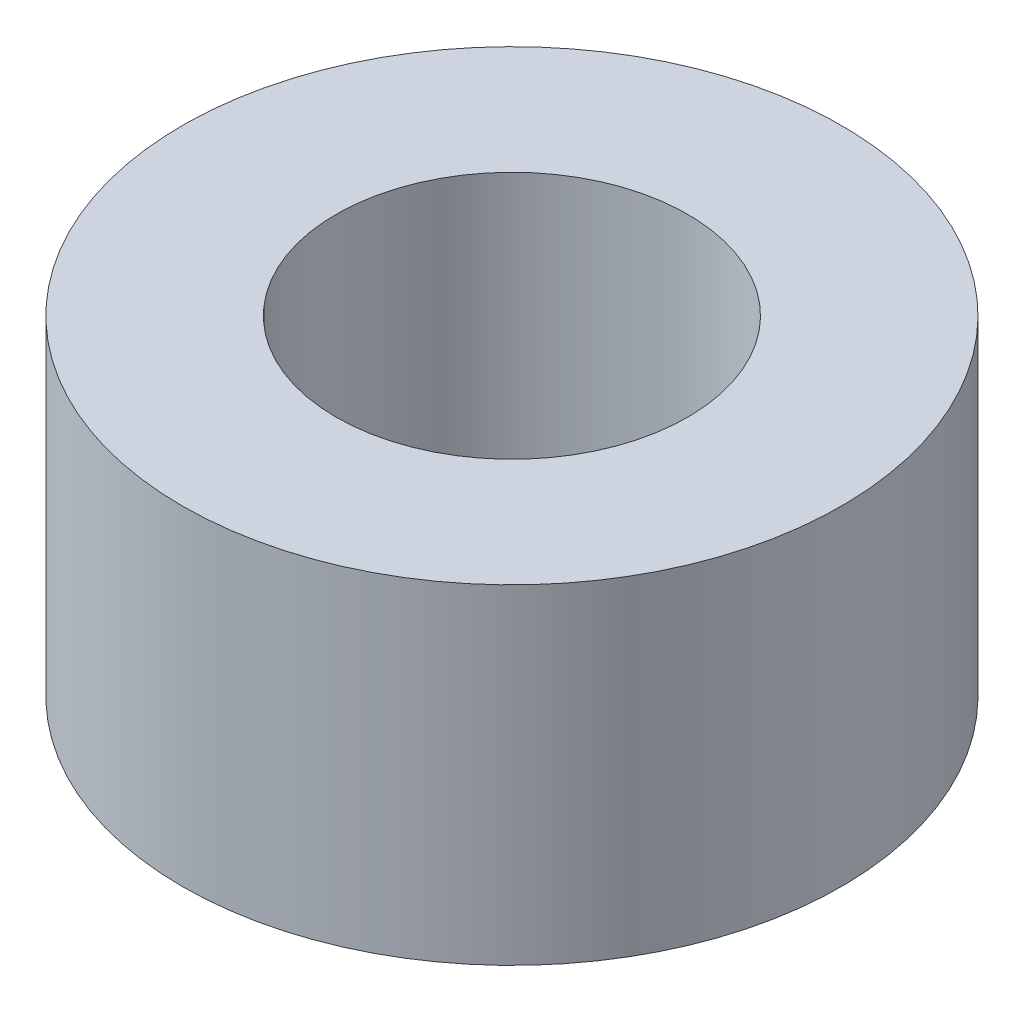
ISO-10303-21;
HEADER;
FILE_DESCRIPTION(('STEP AP214'),'2;1');
FILE_NAME('part.step','',(''),(''),'','','');
FILE_SCHEMA(('AUTOMOTIVE_DESIGN { 1 0 10303 214 1 1 1 1 }'));
ENDSEC;
DATA;
#1=APPLICATION_CONTEXT('core data for automotive mechanical design processes');
#2=APPLICATION_PROTOCOL_DEFINITION('international standard','automotive_design',2000,#1);
#3=PRODUCT_CONTEXT('',#1,'mechanical');
#4=PRODUCT('Part','Part','',(#3));
#5=PRODUCT_RELATED_PRODUCT_CATEGORY('part','',(#4));
#6=PRODUCT_DEFINITION_FORMATION('','',#4);
#7=PRODUCT_DEFINITION_CONTEXT('part definition',#1,'design');
#8=PRODUCT_DEFINITION('design','',#6,#7);
#9=PRODUCT_DEFINITION_SHAPE('','',#8);
#10=(LENGTH_UNIT() NAMED_UNIT(*) SI_UNIT(.MILLI.,.METRE.));
#11=(NAMED_UNIT(*) PLANE_ANGLE_UNIT() SI_UNIT($,.RADIAN.));
#12=(NAMED_UNIT(*) SI_UNIT($,.STERADIAN.) SOLID_ANGLE_UNIT());
#13=UNCERTAINTY_MEASURE_WITH_UNIT(LENGTH_MEASURE(1.E-05),#10,'distance_accuracy_value','');
#14=(GEOMETRIC_REPRESENTATION_CONTEXT(3) GLOBAL_UNCERTAINTY_ASSIGNED_CONTEXT((#13)) GLOBAL_UNIT_ASSIGNED_CONTEXT((#10,
#11,#12)) REPRESENTATION_CONTEXT('',''));
#15=CARTESIAN_POINT('',(0.,0.,0.));
#16=DIRECTION('',(0.,0.,1.));
#17=DIRECTION('',(1.,0.,0.));
#18=AXIS2_PLACEMENT_3D('',#15,#16,#17);
#19=CARTESIAN_POINT('',(0.,3.,0.));
#20=DIRECTION('',(0.,1.,0.));
#21=DIRECTION('',(0.,0.,1.));
#22=AXIS2_PLACEMENT_3D('',#19,#20,#21);
#23=PLANE('',#22);
#24=CARTESIAN_POINT('',(0.,3.,0.));
#25=DIRECTION('',(0.,1.,0.));
#26=DIRECTION('',(0.,0.,1.));
#27=AXIS2_PLACEMENT_3D('',#24,#25,#26);
#28=CIRCLE('',#27,3.);
#29=CARTESIAN_POINT('',(0.,3.,3.));
#30=VERTEX_POINT('',#29);
#31=EDGE_CURVE('E11',#30,#30,#28,.T.);
#32=ORIENTED_EDGE('',*,*,#31,.T.);
#33=EDGE_LOOP('',(#32));
#34=FACE_BOUND('',#33,.T.);
#35=CARTESIAN_POINT('',(0.,3.,0.));
#36=DIRECTION('',(0.,1.,0.));
#37=DIRECTION('',(0.,0.,1.));
#38=AXIS2_PLACEMENT_3D('',#35,#36,#37);
#39=CIRCLE('',#38,1.6);
#40=CARTESIAN_POINT('',(0.,3.,1.6));
#41=VERTEX_POINT('',#40);
#42=EDGE_CURVE('E60',#41,#41,#39,.T.);
#43=ORIENTED_EDGE('',*,*,#42,.F.);
#44=EDGE_LOOP('',(#43));
#45=FACE_BOUND('',#44,.T.);
#46=ADVANCED_FACE('F49',(#34,#45),#23,.T.);
#47=CARTESIAN_POINT('',(0.,0.,0.));
#48=DIRECTION('',(0.,1.,0.));
#49=DIRECTION('',(0.,0.,1.));
#50=AXIS2_PLACEMENT_3D('',#47,#48,#49);
#51=PLANE('',#50);
#52=CARTESIAN_POINT('',(0.,0.,0.));
#53=DIRECTION('',(0.,1.,0.));
#54=DIRECTION('',(0.,0.,1.));
#55=AXIS2_PLACEMENT_3D('',#52,#53,#54);
#56=CIRCLE('',#55,3.);
#57=CARTESIAN_POINT('',(0.,0.,3.));
#58=VERTEX_POINT('',#57);
#59=EDGE_CURVE('E53',#58,#58,#56,.T.);
#60=ORIENTED_EDGE('',*,*,#59,.F.);
#61=EDGE_LOOP('',(#60));
#62=FACE_BOUND('',#61,.T.);
#63=CARTESIAN_POINT('',(0.,0.,0.));
#64=DIRECTION('',(0.,1.,0.));
#65=DIRECTION('',(0.,0.,1.));
#66=AXIS2_PLACEMENT_3D('',#63,#64,#65);
#67=CIRCLE('',#66,1.6);
#68=CARTESIAN_POINT('',(0.,0.,1.6));
#69=VERTEX_POINT('',#68);
#70=EDGE_CURVE('E62',#69,#69,#67,.T.);
#71=ORIENTED_EDGE('',*,*,#70,.T.);
#72=EDGE_LOOP('',(#71));
#73=FACE_BOUND('',#72,.T.);
#74=ADVANCED_FACE('F72',(#62,#73),#51,.F.);
#75=CARTESIAN_POINT('',(0.,3.,0.));
#76=DIRECTION('',(0.,-1.,0.));
#77=DIRECTION('',(0.,0.,-1.));
#78=AXIS2_PLACEMENT_3D('',#75,#76,#77);
#79=CYLINDRICAL_SURFACE('',#78,3.);
#80=ORIENTED_EDGE('',*,*,#31,.F.);
#81=EDGE_LOOP('',(#80));
#82=FACE_BOUND('',#81,.T.);
#83=ORIENTED_EDGE('',*,*,#59,.T.);
#84=EDGE_LOOP('',(#83));
#85=FACE_BOUND('',#84,.T.);
#86=ADVANCED_FACE('F51',(#82,#85),#79,.T.);
#87=CARTESIAN_POINT('',(0.,3.,0.));
#88=DIRECTION('',(0.,-1.,0.));
#89=DIRECTION('',(0.,0.,-1.));
#90=AXIS2_PLACEMENT_3D('',#87,#88,#89);
#91=CYLINDRICAL_SURFACE('',#90,1.6);
#92=ORIENTED_EDGE('',*,*,#42,.T.);
#93=EDGE_LOOP('',(#92));
#94=FACE_BOUND('',#93,.T.);
#95=ORIENTED_EDGE('',*,*,#70,.F.);
#96=EDGE_LOOP('',(#95));
#97=FACE_BOUND('',#96,.T.);
#98=ADVANCED_FACE('F68',(#94,#97),#91,.F.);
#99=CLOSED_SHELL('',(#46,#74,#86,#98));
#100=MANIFOLD_SOLID_BREP('B2',#99);
#101=ADVANCED_BREP_SHAPE_REPRESENTATION('',(#18,#100),#14);
#102=SHAPE_DEFINITION_REPRESENTATION(#9,#101);
ENDSEC;
END-ISO-10303-21;
